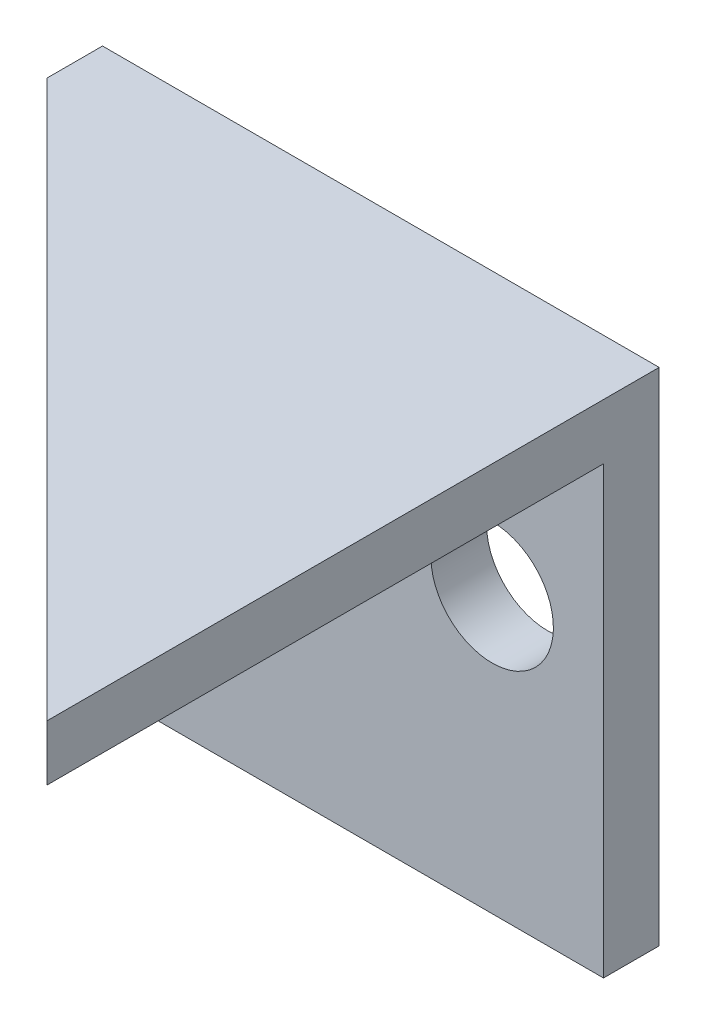
ISO-10303-21;
HEADER;
FILE_DESCRIPTION(('STEP AP214'),'2;1');
FILE_NAME('part.step','',(''),(''),'','','');
FILE_SCHEMA(('AUTOMOTIVE_DESIGN { 1 0 10303 214 1 1 1 1 }'));
ENDSEC;
DATA;
#1=APPLICATION_CONTEXT('core data for automotive mechanical design processes');
#2=APPLICATION_PROTOCOL_DEFINITION('international standard','automotive_design',2000,#1);
#3=PRODUCT_CONTEXT('',#1,'mechanical');
#4=PRODUCT('Part','Part','',(#3));
#5=PRODUCT_RELATED_PRODUCT_CATEGORY('part','',(#4));
#6=PRODUCT_DEFINITION_FORMATION('','',#4);
#7=PRODUCT_DEFINITION_CONTEXT('part definition',#1,'design');
#8=PRODUCT_DEFINITION('design','',#6,#7);
#9=PRODUCT_DEFINITION_SHAPE('','',#8);
#10=(LENGTH_UNIT() NAMED_UNIT(*) SI_UNIT(.MILLI.,.METRE.));
#11=(NAMED_UNIT(*) PLANE_ANGLE_UNIT() SI_UNIT($,.RADIAN.));
#12=(NAMED_UNIT(*) SI_UNIT($,.STERADIAN.) SOLID_ANGLE_UNIT());
#13=UNCERTAINTY_MEASURE_WITH_UNIT(LENGTH_MEASURE(1.E-05),#10,'distance_accuracy_value','');
#14=(GEOMETRIC_REPRESENTATION_CONTEXT(3) GLOBAL_UNCERTAINTY_ASSIGNED_CONTEXT((#13)) GLOBAL_UNIT_ASSIGNED_CONTEXT((#10,
#11,#12)) REPRESENTATION_CONTEXT('',''));
#15=CARTESIAN_POINT('',(0.,0.,0.));
#16=DIRECTION('',(0.,0.,1.));
#17=DIRECTION('',(1.,0.,0.));
#18=AXIS2_PLACEMENT_3D('',#15,#16,#17);
#19=CARTESIAN_POINT('',(-15.,15.,0.));
#20=DIRECTION('',(0.,0.,-1.));
#21=DIRECTION('',(-1.,0.,0.));
#22=AXIS2_PLACEMENT_3D('',#19,#20,#21);
#23=PLANE('',#22);
#24=CARTESIAN_POINT('',(-9.,3.,0.));
#25=DIRECTION('',(0.,0.,-1.));
#26=DIRECTION('',(-1.,0.,0.));
#27=AXIS2_PLACEMENT_3D('',#24,#25,#26);
#28=CIRCLE('',#27,3.3);
#29=CARTESIAN_POINT('',(-12.3,3.,0.));
#30=VERTEX_POINT('',#29);
#31=EDGE_CURVE('E130',#30,#30,#28,.T.);
#32=ORIENTED_EDGE('',*,*,#31,.F.);
#33=EDGE_LOOP('',(#32));
#34=FACE_BOUND('',#33,.T.);
#35=CARTESIAN_POINT('',(8.99999999999999,3.,0.));
#36=DIRECTION('',(0.,0.,-1.));
#37=DIRECTION('',(-1.,0.,0.));
#38=AXIS2_PLACEMENT_3D('',#35,#36,#37);
#39=CIRCLE('',#38,3.3);
#40=CARTESIAN_POINT('',(5.69999999999999,3.,0.));
#41=VERTEX_POINT('',#40);
#42=EDGE_CURVE('E120',#41,#41,#39,.T.);
#43=ORIENTED_EDGE('',*,*,#42,.F.);
#44=EDGE_LOOP('',(#43));
#45=FACE_BOUND('',#44,.T.);
#46=DIRECTION('',(0.,-1.,0.));
#47=VECTOR('',#46,1.);
#48=CARTESIAN_POINT('',(15.,15.,0.));
#49=LINE('',#48,#47);
#50=CARTESIAN_POINT('',(15.,15.,0.));
#51=VERTEX_POINT('',#50);
#52=CARTESIAN_POINT('',(15.,-12.,0.));
#53=VERTEX_POINT('',#52);
#54=EDGE_CURVE('E98',#51,#53,#49,.T.);
#55=ORIENTED_EDGE('',*,*,#54,.T.);
#56=DIRECTION('',(1.,0.,0.));
#57=VECTOR('',#56,1.);
#58=CARTESIAN_POINT('',(15.,-12.,0.));
#59=LINE('',#58,#57);
#60=CARTESIAN_POINT('',(-15.,-12.,0.));
#61=VERTEX_POINT('',#60);
#62=EDGE_CURVE('E137',#61,#53,#59,.T.);
#63=ORIENTED_EDGE('',*,*,#62,.F.);
#64=DIRECTION('',(0.,-1.,0.));
#65=VECTOR('',#64,1.);
#66=CARTESIAN_POINT('',(-15.,15.,0.));
#67=LINE('',#66,#65);
#68=CARTESIAN_POINT('',(-15.,15.,0.));
#69=VERTEX_POINT('',#68);
#70=EDGE_CURVE('E11',#69,#61,#67,.T.);
#71=ORIENTED_EDGE('',*,*,#70,.F.);
#72=DIRECTION('',(1.,0.,0.));
#73=VECTOR('',#72,1.);
#74=CARTESIAN_POINT('',(-15.,15.,0.));
#75=LINE('',#74,#73);
#76=EDGE_CURVE('E108',#69,#51,#75,.T.);
#77=ORIENTED_EDGE('',*,*,#76,.T.);
#78=EDGE_LOOP('',(#55,#63,#71,#77));
#79=FACE_BOUND('',#78,.T.);
#80=ADVANCED_FACE('F33',(#34,#45,#79),#23,.T.);
#81=CARTESIAN_POINT('',(-15.,15.,3.));
#82=DIRECTION('',(-1.,0.,0.));
#83=DIRECTION('',(0.,0.,1.));
#84=AXIS2_PLACEMENT_3D('',#81,#82,#83);
#85=PLANE('',#84);
#86=ORIENTED_EDGE('',*,*,#70,.T.);
#87=DIRECTION('',(0.,0.,-1.));
#88=VECTOR('',#87,1.);
#89=CARTESIAN_POINT('',(-15.,-12.,0.));
#90=LINE('',#89,#88);
#91=CARTESIAN_POINT('',(-15.,-12.,3.));
#92=VERTEX_POINT('',#91);
#93=EDGE_CURVE('E134',#92,#61,#90,.T.);
#94=ORIENTED_EDGE('',*,*,#93,.F.);
#95=DIRECTION('',(0.,1.,0.));
#96=VECTOR('',#95,1.);
#97=CARTESIAN_POINT('',(-15.,-12.,3.));
#98=LINE('',#97,#96);
#99=CARTESIAN_POINT('',(-15.,12.,3.));
#100=VERTEX_POINT('',#99);
#101=EDGE_CURVE('E115',#92,#100,#98,.T.);
#102=ORIENTED_EDGE('',*,*,#101,.T.);
#103=DIRECTION('',(0.,-1.,0.));
#104=VECTOR('',#103,1.);
#105=CARTESIAN_POINT('',(-15.,15.,3.));
#106=LINE('',#105,#104);
#107=CARTESIAN_POINT('',(-15.,15.,3.));
#108=VERTEX_POINT('',#107);
#109=EDGE_CURVE('E41',#108,#100,#106,.T.);
#110=ORIENTED_EDGE('',*,*,#109,.F.);
#111=DIRECTION('',(0.,0.,-1.));
#112=VECTOR('',#111,1.);
#113=CARTESIAN_POINT('',(-15.,15.,3.));
#114=LINE('',#113,#112);
#115=EDGE_CURVE('E105',#108,#69,#114,.T.);
#116=ORIENTED_EDGE('',*,*,#115,.T.);
#117=EDGE_LOOP('',(#86,#94,#102,#110,#116));
#118=FACE_BOUND('',#117,.T.);
#119=ADVANCED_FACE('F146',(#118),#85,.T.);
#120=CARTESIAN_POINT('',(15.,15.,33.));
#121=DIRECTION('',(-0.707106781186548,0.,0.707106781186547));
#122=DIRECTION('',(0.707106781186547,0.,0.707106781186548));
#123=AXIS2_PLACEMENT_3D('',#120,#121,#122);
#124=PLANE('',#123);
#125=DIRECTION('',(-0.707106781186547,0.,-0.707106781186548));
#126=VECTOR('',#125,1.);
#127=CARTESIAN_POINT('',(15.,12.,33.));
#128=LINE('',#127,#126);
#129=CARTESIAN_POINT('',(15.,12.,33.));
#130=VERTEX_POINT('',#129);
#131=EDGE_CURVE('E95',#130,#100,#128,.T.);
#132=ORIENTED_EDGE('',*,*,#131,.F.);
#133=DIRECTION('',(0.,-1.,0.));
#134=VECTOR('',#133,1.);
#135=CARTESIAN_POINT('',(15.,15.,33.));
#136=LINE('',#135,#134);
#137=CARTESIAN_POINT('',(15.,15.,33.));
#138=VERTEX_POINT('',#137);
#139=EDGE_CURVE('E89',#138,#130,#136,.T.);
#140=ORIENTED_EDGE('',*,*,#139,.F.);
#141=DIRECTION('',(-0.707106781186547,0.,-0.707106781186548));
#142=VECTOR('',#141,1.);
#143=CARTESIAN_POINT('',(15.,15.,33.));
#144=LINE('',#143,#142);
#145=EDGE_CURVE('E93',#138,#108,#144,.T.);
#146=ORIENTED_EDGE('',*,*,#145,.T.);
#147=ORIENTED_EDGE('',*,*,#109,.T.);
#148=EDGE_LOOP('',(#132,#140,#146,#147));
#149=FACE_BOUND('',#148,.T.);
#150=ADVANCED_FACE('F91',(#149),#124,.T.);
#151=CARTESIAN_POINT('',(15.,15.,0.));
#152=DIRECTION('',(1.,0.,0.));
#153=DIRECTION('',(0.,0.,-1.));
#154=AXIS2_PLACEMENT_3D('',#151,#152,#153);
#155=PLANE('',#154);
#156=DIRECTION('',(0.,0.,1.));
#157=VECTOR('',#156,1.);
#158=CARTESIAN_POINT('',(15.,12.,0.));
#159=LINE('',#158,#157);
#160=CARTESIAN_POINT('',(15.,12.,3.));
#161=VERTEX_POINT('',#160);
#162=EDGE_CURVE('E65',#161,#130,#159,.T.);
#163=ORIENTED_EDGE('',*,*,#162,.F.);
#164=DIRECTION('',(0.,1.,0.));
#165=VECTOR('',#164,1.);
#166=CARTESIAN_POINT('',(15.,-12.,3.));
#167=LINE('',#166,#165);
#168=CARTESIAN_POINT('',(15.,-12.,3.));
#169=VERTEX_POINT('',#168);
#170=EDGE_CURVE('E139',#169,#161,#167,.T.);
#171=ORIENTED_EDGE('',*,*,#170,.F.);
#172=DIRECTION('',(0.,0.,1.));
#173=VECTOR('',#172,1.);
#174=CARTESIAN_POINT('',(15.,-12.,3.));
#175=LINE('',#174,#173);
#176=EDGE_CURVE('E76',#53,#169,#175,.T.);
#177=ORIENTED_EDGE('',*,*,#176,.F.);
#178=ORIENTED_EDGE('',*,*,#54,.F.);
#179=DIRECTION('',(0.,0.,1.));
#180=VECTOR('',#179,1.);
#181=CARTESIAN_POINT('',(15.,15.,0.));
#182=LINE('',#181,#180);
#183=EDGE_CURVE('E103',#51,#138,#182,.T.);
#184=ORIENTED_EDGE('',*,*,#183,.T.);
#185=ORIENTED_EDGE('',*,*,#139,.T.);
#186=EDGE_LOOP('',(#163,#171,#177,#178,#184,#185));
#187=FACE_BOUND('',#186,.T.);
#188=ADVANCED_FACE('F107',(#187),#155,.T.);
#189=CARTESIAN_POINT('',(0.,15.,0.));
#190=DIRECTION('',(0.,-1.,0.));
#191=DIRECTION('',(0.,0.,-1.));
#192=AXIS2_PLACEMENT_3D('',#189,#190,#191);
#193=PLANE('',#192);
#194=ORIENTED_EDGE('',*,*,#76,.F.);
#195=ORIENTED_EDGE('',*,*,#115,.F.);
#196=ORIENTED_EDGE('',*,*,#145,.F.);
#197=ORIENTED_EDGE('',*,*,#183,.F.);
#198=EDGE_LOOP('',(#194,#195,#196,#197));
#199=FACE_BOUND('',#198,.T.);
#200=ADVANCED_FACE('F102',(#199),#193,.F.);
#201=CARTESIAN_POINT('',(0.,12.,0.));
#202=DIRECTION('',(0.,-1.,0.));
#203=DIRECTION('',(0.,0.,-1.));
#204=AXIS2_PLACEMENT_3D('',#201,#202,#203);
#205=PLANE('',#204);
#206=DIRECTION('',(-1.,0.,0.));
#207=VECTOR('',#206,1.);
#208=CARTESIAN_POINT('',(-15.,12.,3.));
#209=LINE('',#208,#207);
#210=EDGE_CURVE('E49',#161,#100,#209,.T.);
#211=ORIENTED_EDGE('',*,*,#210,.F.);
#212=ORIENTED_EDGE('',*,*,#162,.T.);
#213=ORIENTED_EDGE('',*,*,#131,.T.);
#214=EDGE_LOOP('',(#211,#212,#213));
#215=FACE_BOUND('',#214,.T.);
#216=ADVANCED_FACE('F170',(#215),#205,.T.);
#217=CARTESIAN_POINT('',(-15.,-12.,3.));
#218=DIRECTION('',(0.,0.,-1.));
#219=DIRECTION('',(0.,1.,0.));
#220=AXIS2_PLACEMENT_3D('',#217,#218,#219);
#221=PLANE('',#220);
#222=CARTESIAN_POINT('',(-9.,3.,3.));
#223=DIRECTION('',(0.,0.,-1.));
#224=DIRECTION('',(0.,1.,0.));
#225=AXIS2_PLACEMENT_3D('',#222,#223,#224);
#226=CIRCLE('',#225,3.3);
#227=CARTESIAN_POINT('',(-9.,6.3,3.));
#228=VERTEX_POINT('',#227);
#229=EDGE_CURVE('E36',#228,#228,#226,.T.);
#230=ORIENTED_EDGE('',*,*,#229,.T.);
#231=EDGE_LOOP('',(#230));
#232=FACE_BOUND('',#231,.T.);
#233=CARTESIAN_POINT('',(8.99999999999999,3.,3.));
#234=DIRECTION('',(0.,0.,-1.));
#235=DIRECTION('',(0.,1.,0.));
#236=AXIS2_PLACEMENT_3D('',#233,#234,#235);
#237=CIRCLE('',#236,3.3);
#238=CARTESIAN_POINT('',(8.99999999999999,6.3,3.));
#239=VERTEX_POINT('',#238);
#240=EDGE_CURVE('E118',#239,#239,#237,.T.);
#241=ORIENTED_EDGE('',*,*,#240,.T.);
#242=EDGE_LOOP('',(#241));
#243=FACE_BOUND('',#242,.T.);
#244=ORIENTED_EDGE('',*,*,#210,.T.);
#245=ORIENTED_EDGE('',*,*,#101,.F.);
#246=DIRECTION('',(-1.,0.,0.));
#247=VECTOR('',#246,1.);
#248=CARTESIAN_POINT('',(-15.,-12.,3.));
#249=LINE('',#248,#247);
#250=EDGE_CURVE('E123',#169,#92,#249,.T.);
#251=ORIENTED_EDGE('',*,*,#250,.F.);
#252=ORIENTED_EDGE('',*,*,#170,.T.);
#253=EDGE_LOOP('',(#244,#245,#251,#252));
#254=FACE_BOUND('',#253,.T.);
#255=ADVANCED_FACE('F149',(#232,#243,#254),#221,.F.);
#256=CARTESIAN_POINT('',(0.,-12.,0.));
#257=DIRECTION('',(0.,1.,0.));
#258=DIRECTION('',(-1.,0.,0.));
#259=AXIS2_PLACEMENT_3D('',#256,#257,#258);
#260=PLANE('',#259);
#261=ORIENTED_EDGE('',*,*,#250,.T.);
#262=ORIENTED_EDGE('',*,*,#93,.T.);
#263=ORIENTED_EDGE('',*,*,#62,.T.);
#264=ORIENTED_EDGE('',*,*,#176,.T.);
#265=EDGE_LOOP('',(#261,#262,#263,#264));
#266=FACE_BOUND('',#265,.T.);
#267=ADVANCED_FACE('F150',(#266),#260,.F.);
#268=CARTESIAN_POINT('',(8.99999999999999,3.,10.));
#269=DIRECTION('',(0.,0.,-1.));
#270=DIRECTION('',(-1.,0.,0.));
#271=AXIS2_PLACEMENT_3D('',#268,#269,#270);
#272=CYLINDRICAL_SURFACE('',#271,3.3);
#273=ORIENTED_EDGE('',*,*,#42,.T.);
#274=EDGE_LOOP('',(#273));
#275=FACE_BOUND('',#274,.T.);
#276=ORIENTED_EDGE('',*,*,#240,.F.);
#277=EDGE_LOOP('',(#276));
#278=FACE_BOUND('',#277,.T.);
#279=ADVANCED_FACE('F165',(#275,#278),#272,.F.);
#280=CARTESIAN_POINT('',(-9.,3.,10.));
#281=DIRECTION('',(0.,0.,-1.));
#282=DIRECTION('',(-1.,0.,0.));
#283=AXIS2_PLACEMENT_3D('',#280,#281,#282);
#284=CYLINDRICAL_SURFACE('',#283,3.3);
#285=ORIENTED_EDGE('',*,*,#31,.T.);
#286=EDGE_LOOP('',(#285));
#287=FACE_BOUND('',#286,.T.);
#288=ORIENTED_EDGE('',*,*,#229,.F.);
#289=EDGE_LOOP('',(#288));
#290=FACE_BOUND('',#289,.T.);
#291=ADVANCED_FACE('F162',(#287,#290),#284,.F.);
#292=CLOSED_SHELL('',(#80,#119,#150,#188,#200,#216,#255,#267,#279,#291));
#293=MANIFOLD_SOLID_BREP('B2',#292);
#294=ADVANCED_BREP_SHAPE_REPRESENTATION('',(#18,#293),#14);
#295=SHAPE_DEFINITION_REPRESENTATION(#9,#294);
ENDSEC;
END-ISO-10303-21;
